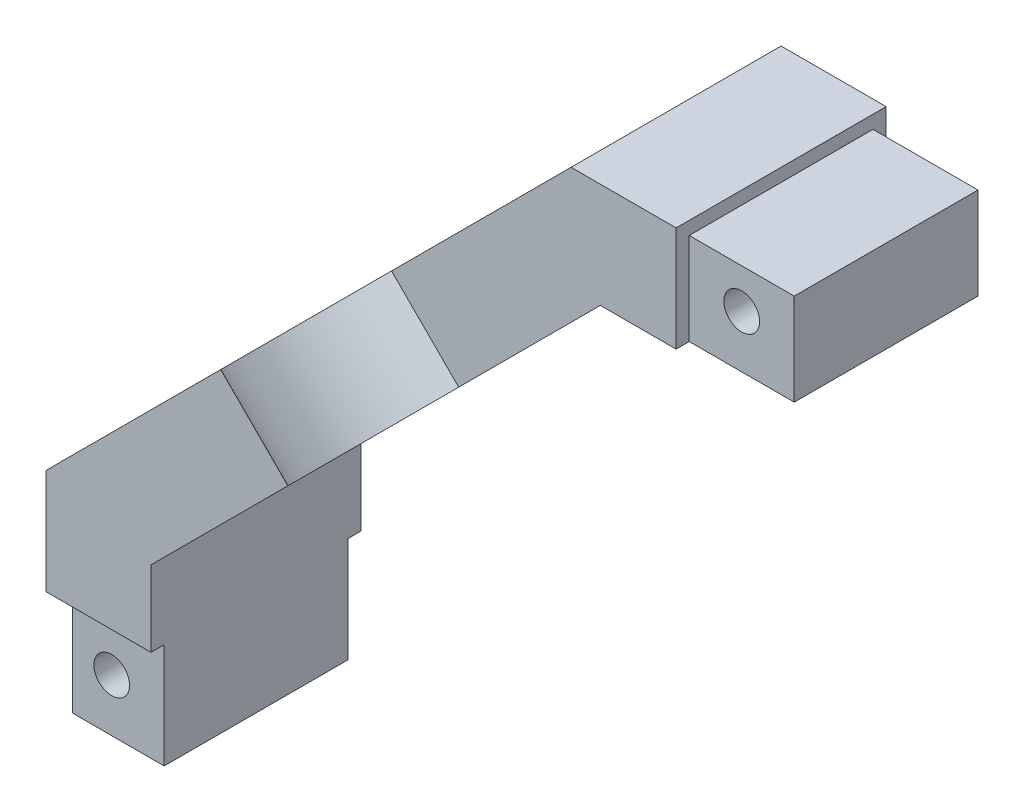
ISO-10303-21;
HEADER;
FILE_DESCRIPTION(('STEP AP214'),'2;1');
FILE_NAME('part.step','',(''),(''),'','','');
FILE_SCHEMA(('AUTOMOTIVE_DESIGN { 1 0 10303 214 1 1 1 1 }'));
ENDSEC;
DATA;
#1=APPLICATION_CONTEXT('core data for automotive mechanical design processes');
#2=APPLICATION_PROTOCOL_DEFINITION('international standard','automotive_design',2000,#1);
#3=PRODUCT_CONTEXT('',#1,'mechanical');
#4=PRODUCT('Part','Part','',(#3));
#5=PRODUCT_RELATED_PRODUCT_CATEGORY('part','',(#4));
#6=PRODUCT_DEFINITION_FORMATION('','',#4);
#7=PRODUCT_DEFINITION_CONTEXT('part definition',#1,'design');
#8=PRODUCT_DEFINITION('design','',#6,#7);
#9=PRODUCT_DEFINITION_SHAPE('','',#8);
#10=(LENGTH_UNIT() NAMED_UNIT(*) SI_UNIT(.MILLI.,.METRE.));
#11=(NAMED_UNIT(*) PLANE_ANGLE_UNIT() SI_UNIT($,.RADIAN.));
#12=(NAMED_UNIT(*) SI_UNIT($,.STERADIAN.) SOLID_ANGLE_UNIT());
#13=UNCERTAINTY_MEASURE_WITH_UNIT(LENGTH_MEASURE(1.E-05),#10,'distance_accuracy_value','');
#14=(GEOMETRIC_REPRESENTATION_CONTEXT(3) GLOBAL_UNCERTAINTY_ASSIGNED_CONTEXT((#13)) GLOBAL_UNIT_ASSIGNED_CONTEXT((#10,
#11,#12)) REPRESENTATION_CONTEXT('',''));
#15=CARTESIAN_POINT('',(0.,0.,0.));
#16=DIRECTION('',(0.,0.,1.));
#17=DIRECTION('',(1.,0.,0.));
#18=AXIS2_PLACEMENT_3D('',#15,#16,#17);
#19=CARTESIAN_POINT('',(0.,0.,0.));
#20=DIRECTION('',(0.,0.,1.));
#21=DIRECTION('',(1.,0.,0.));
#22=AXIS2_PLACEMENT_3D('',#19,#20,#21);
#23=PLANE('',#22);
#24=DIRECTION('',(-0.707106781186544,-0.707106781186551,0.));
#25=VECTOR('',#24,1.);
#26=CARTESIAN_POINT('',(39.8696158183966,-39.8696158183963,0.));
#27=LINE('',#26,#25);
#28=CARTESIAN_POINT('',(67.0392316367926,-12.7,0.));
#29=VERTEX_POINT('',#28);
#30=CARTESIAN_POINT('',(49.9098473894309,-29.8293842473619,0.));
#31=VERTEX_POINT('',#30);
#32=EDGE_CURVE('E314',#29,#31,#27,.T.);
#33=ORIENTED_EDGE('',*,*,#32,.T.);
#34=DIRECTION('',(-0.707106781186548,0.707106781186547,0.));
#35=VECTOR('',#34,1.);
#36=CARTESIAN_POINT('',(49.9098473894309,-29.829384247362,0.));
#37=LINE('',#36,#35);
#38=CARTESIAN_POINT('',(41.7902315710345,-21.7097684289655,0.));
#39=VERTEX_POINT('',#38);
#40=EDGE_CURVE('E204',#31,#39,#37,.T.);
#41=ORIENTED_EDGE('',*,*,#40,.T.);
#42=DIRECTION('',(0.707106781186547,0.707106781186548,0.));
#43=VECTOR('',#42,1.);
#44=CARTESIAN_POINT('',(31.75,-31.75,0.));
#45=LINE('',#44,#43);
#46=CARTESIAN_POINT('',(63.5,0.,0.));
#47=VERTEX_POINT('',#46);
#48=EDGE_CURVE('E273',#39,#47,#45,.T.);
#49=ORIENTED_EDGE('',*,*,#48,.T.);
#50=DIRECTION('',(1.,0.,0.));
#51=VECTOR('',#50,1.);
#52=CARTESIAN_POINT('',(0.,0.,0.));
#53=LINE('',#52,#51);
#54=CARTESIAN_POINT('',(76.2,0.,0.));
#55=VERTEX_POINT('',#54);
#56=EDGE_CURVE('E320',#47,#55,#53,.T.);
#57=ORIENTED_EDGE('',*,*,#56,.T.);
#58=DIRECTION('',(0.,-1.,0.));
#59=VECTOR('',#58,1.);
#60=CARTESIAN_POINT('',(76.2,0.,0.));
#61=LINE('',#60,#59);
#62=CARTESIAN_POINT('',(76.2,-12.7,0.));
#63=VERTEX_POINT('',#62);
#64=EDGE_CURVE('E264',#55,#63,#61,.T.);
#65=ORIENTED_EDGE('',*,*,#64,.T.);
#66=DIRECTION('',(1.,0.,0.));
#67=VECTOR('',#66,1.);
#68=CARTESIAN_POINT('',(0.,-12.7,0.));
#69=LINE('',#68,#67);
#70=EDGE_CURVE('E317',#29,#63,#69,.T.);
#71=ORIENTED_EDGE('',*,*,#70,.F.);
#72=EDGE_LOOP('',(#33,#41,#49,#57,#65,#71));
#73=FACE_BOUND('',#72,.T.);
#74=ADVANCED_FACE('F38',(#73),#23,.F.);
#75=CARTESIAN_POINT('',(0.,0.,25.4));
#76=DIRECTION('',(0.,0.,1.));
#77=DIRECTION('',(1.,0.,0.));
#78=AXIS2_PLACEMENT_3D('',#75,#76,#77);
#79=PLANE('',#78);
#80=DIRECTION('',(-0.707106781186548,0.707106781186547,0.));
#81=VECTOR('',#80,1.);
#82=CARTESIAN_POINT('',(49.9098473894309,-29.829384247362,25.4));
#83=LINE('',#82,#81);
#84=CARTESIAN_POINT('',(49.9098473894309,-29.8293842473619,25.4));
#85=VERTEX_POINT('',#84);
#86=CARTESIAN_POINT('',(41.7902315710345,-21.7097684289655,25.4));
#87=VERTEX_POINT('',#86);
#88=EDGE_CURVE('E12',#85,#87,#83,.T.);
#89=ORIENTED_EDGE('',*,*,#88,.F.);
#90=DIRECTION('',(-0.707106781186544,-0.707106781186551,0.));
#91=VECTOR('',#90,1.);
#92=CARTESIAN_POINT('',(39.8696158183966,-39.8696158183963,25.4));
#93=LINE('',#92,#91);
#94=CARTESIAN_POINT('',(67.0392316367926,-12.7,25.4));
#95=VERTEX_POINT('',#94);
#96=EDGE_CURVE('E184',#95,#85,#93,.T.);
#97=ORIENTED_EDGE('',*,*,#96,.F.);
#98=DIRECTION('',(1.,0.,0.));
#99=VECTOR('',#98,1.);
#100=CARTESIAN_POINT('',(0.,-12.7,25.4));
#101=LINE('',#100,#99);
#102=CARTESIAN_POINT('',(76.2,-12.7,25.4));
#103=VERTEX_POINT('',#102);
#104=EDGE_CURVE('E297',#95,#103,#101,.T.);
#105=ORIENTED_EDGE('',*,*,#104,.T.);
#106=DIRECTION('',(0.,-1.,0.));
#107=VECTOR('',#106,1.);
#108=CARTESIAN_POINT('',(76.2,0.,25.4));
#109=LINE('',#108,#107);
#110=CARTESIAN_POINT('',(76.2,0.,25.4));
#111=VERTEX_POINT('',#110);
#112=EDGE_CURVE('E267',#111,#103,#109,.T.);
#113=ORIENTED_EDGE('',*,*,#112,.F.);
#114=DIRECTION('',(1.,0.,0.));
#115=VECTOR('',#114,1.);
#116=CARTESIAN_POINT('',(0.,0.,25.4));
#117=LINE('',#116,#115);
#118=CARTESIAN_POINT('',(63.5,0.,25.4));
#119=VERTEX_POINT('',#118);
#120=EDGE_CURVE('E300',#119,#111,#117,.T.);
#121=ORIENTED_EDGE('',*,*,#120,.F.);
#122=DIRECTION('',(0.707106781186547,0.707106781186548,0.));
#123=VECTOR('',#122,1.);
#124=CARTESIAN_POINT('',(31.75,-31.75,25.4));
#125=LINE('',#124,#123);
#126=EDGE_CURVE('E293',#87,#119,#125,.T.);
#127=ORIENTED_EDGE('',*,*,#126,.F.);
#128=EDGE_LOOP('',(#89,#97,#105,#113,#121,#127));
#129=FACE_BOUND('',#128,.T.);
#130=ADVANCED_FACE('F388',(#129),#79,.T.);
#131=CARTESIAN_POINT('',(0.,-63.5,0.));
#132=VERTEX_POINT('',#131);
#133=CARTESIAN_POINT('',(21.7097684289653,-41.7902315710347,0.));
#134=VERTEX_POINT('',#133);
#135=EDGE_CURVE('E304',#132,#134,#45,.T.);
#136=ORIENTED_EDGE('',*,*,#135,.T.);
#137=DIRECTION('',(-0.707106781186548,0.707106781186547,0.));
#138=VECTOR('',#137,1.);
#139=CARTESIAN_POINT('',(29.8293842473617,-49.9098473894312,0.));
#140=LINE('',#139,#138);
#141=CARTESIAN_POINT('',(29.8293842473618,-49.9098473894312,0.));
#142=VERTEX_POINT('',#141);
#143=EDGE_CURVE('E202',#134,#142,#140,.F.);
#144=ORIENTED_EDGE('',*,*,#143,.T.);
#145=CARTESIAN_POINT('',(12.7,-67.0392316367931,0.));
#146=VERTEX_POINT('',#145);
#147=EDGE_CURVE('E313',#142,#146,#27,.T.);
#148=ORIENTED_EDGE('',*,*,#147,.T.);
#149=DIRECTION('',(0.,-1.,0.));
#150=VECTOR('',#149,1.);
#151=CARTESIAN_POINT('',(12.7,0.,0.));
#152=LINE('',#151,#150);
#153=CARTESIAN_POINT('',(12.7,-76.2,0.));
#154=VERTEX_POINT('',#153);
#155=EDGE_CURVE('E310',#146,#154,#152,.T.);
#156=ORIENTED_EDGE('',*,*,#155,.T.);
#157=DIRECTION('',(-1.,0.,0.));
#158=VECTOR('',#157,1.);
#159=CARTESIAN_POINT('',(0.,-76.2,0.));
#160=LINE('',#159,#158);
#161=CARTESIAN_POINT('',(0.,-76.2,0.));
#162=VERTEX_POINT('',#161);
#163=EDGE_CURVE('E278',#154,#162,#160,.T.);
#164=ORIENTED_EDGE('',*,*,#163,.T.);
#165=DIRECTION('',(0.,-1.,0.));
#166=VECTOR('',#165,1.);
#167=CARTESIAN_POINT('',(0.,0.,0.));
#168=LINE('',#167,#166);
#169=EDGE_CURVE('E307',#132,#162,#168,.T.);
#170=ORIENTED_EDGE('',*,*,#169,.F.);
#171=EDGE_LOOP('',(#136,#144,#148,#156,#164,#170));
#172=FACE_BOUND('',#171,.T.);
#173=ADVANCED_FACE('F371',(#172),#23,.F.);
#174=CARTESIAN_POINT('',(31.75,-31.75,25.4));
#175=DIRECTION('',(-0.707106781186548,0.707106781186547,0.));
#176=DIRECTION('',(-0.707106781186547,-0.707106781186548,0.));
#177=AXIS2_PLACEMENT_3D('',#174,#175,#176);
#178=PLANE('',#177);
#179=CARTESIAN_POINT('',(31.7499999999998,-31.7500000000002,12.7));
#180=DIRECTION('',(-0.707106781186548,0.707106781186547,0.));
#181=DIRECTION('',(-0.707106781186547,-0.707106781186548,0.));
#182=AXIS2_PLACEMENT_3D('',#179,#180,#181);
#183=CIRCLE('',#182,11.1125);
#184=CARTESIAN_POINT('',(23.8922758940643,-39.6077241059357,12.7));
#185=VERTEX_POINT('',#184);
#186=EDGE_CURVE('E198',#185,#185,#183,.F.);
#187=ORIENTED_EDGE('',*,*,#186,.T.);
#188=EDGE_LOOP('',(#187));
#189=FACE_BOUND('',#188,.T.);
#190=CARTESIAN_POINT('',(0.,-63.5,25.4));
#191=VERTEX_POINT('',#190);
#192=CARTESIAN_POINT('',(21.7097684289653,-41.7902315710347,25.4));
#193=VERTEX_POINT('',#192);
#194=EDGE_CURVE('E290',#191,#193,#125,.T.);
#195=ORIENTED_EDGE('',*,*,#194,.T.);
#196=CARTESIAN_POINT('',(31.7499999999999,-31.7500000000001,12.7));
#197=DIRECTION('',(-0.707106781186548,0.707106781186547,0.));
#198=DIRECTION('',(-0.707106781186547,-0.707106781186548,0.));
#199=AXIS2_PLACEMENT_3D('',#196,#197,#198);
#200=CIRCLE('',#199,19.05);
#201=EDGE_CURVE('E192',#87,#193,#200,.F.);
#202=ORIENTED_EDGE('',*,*,#201,.F.);
#203=ORIENTED_EDGE('',*,*,#126,.T.);
#204=DIRECTION('',(0.,0.,-1.));
#205=VECTOR('',#204,1.);
#206=CARTESIAN_POINT('',(63.5,0.,25.4));
#207=LINE('',#206,#205);
#208=EDGE_CURVE('E303',#119,#47,#207,.T.);
#209=ORIENTED_EDGE('',*,*,#208,.T.);
#210=ORIENTED_EDGE('',*,*,#48,.F.);
#211=EDGE_CURVE('E196',#134,#39,#200,.F.);
#212=ORIENTED_EDGE('',*,*,#211,.F.);
#213=ORIENTED_EDGE('',*,*,#135,.F.);
#214=DIRECTION('',(0.,0.,-1.));
#215=VECTOR('',#214,1.);
#216=CARTESIAN_POINT('',(0.,-63.5,25.4));
#217=LINE('',#216,#215);
#218=EDGE_CURVE('E335',#191,#132,#217,.T.);
#219=ORIENTED_EDGE('',*,*,#218,.F.);
#220=EDGE_LOOP('',(#195,#202,#203,#209,#210,#212,#213,#219));
#221=FACE_BOUND('',#220,.T.);
#222=ADVANCED_FACE('F40',(#189,#221),#178,.T.);
#223=CARTESIAN_POINT('',(0.,0.,25.4));
#224=DIRECTION('',(1.,0.,0.));
#225=DIRECTION('',(0.,1.,0.));
#226=AXIS2_PLACEMENT_3D('',#223,#224,#225);
#227=PLANE('',#226);
#228=ORIENTED_EDGE('',*,*,#169,.T.);
#229=DIRECTION('',(0.,0.,1.));
#230=VECTOR('',#229,1.);
#231=CARTESIAN_POINT('',(0.,-76.2,0.));
#232=LINE('',#231,#230);
#233=CARTESIAN_POINT('',(0.,-76.2,25.4));
#234=VERTEX_POINT('',#233);
#235=EDGE_CURVE('E269',#162,#234,#232,.T.);
#236=ORIENTED_EDGE('',*,*,#235,.T.);
#237=DIRECTION('',(0.,-1.,0.));
#238=VECTOR('',#237,1.);
#239=CARTESIAN_POINT('',(0.,0.,25.4));
#240=LINE('',#239,#238);
#241=EDGE_CURVE('E292',#191,#234,#240,.T.);
#242=ORIENTED_EDGE('',*,*,#241,.F.);
#243=ORIENTED_EDGE('',*,*,#218,.T.);
#244=EDGE_LOOP('',(#228,#236,#242,#243));
#245=FACE_BOUND('',#244,.T.);
#246=ADVANCED_FACE('F367',(#245),#227,.F.);
#247=CARTESIAN_POINT('',(0.,-88.9,25.4));
#248=DIRECTION('',(0.,1.,0.));
#249=DIRECTION('',(-1.,0.,0.));
#250=AXIS2_PLACEMENT_3D('',#247,#248,#249);
#251=PLANE('',#250);
#252=DIRECTION('',(0.,0.,-1.));
#253=VECTOR('',#252,1.);
#254=CARTESIAN_POINT('',(12.7,-88.9,25.4));
#255=LINE('',#254,#253);
#256=CARTESIAN_POINT('',(12.7,-88.9,23.8125));
#257=VERTEX_POINT('',#256);
#258=CARTESIAN_POINT('',(12.7,-88.9,1.5748));
#259=VERTEX_POINT('',#258);
#260=EDGE_CURVE('E332',#257,#259,#255,.T.);
#261=ORIENTED_EDGE('',*,*,#260,.F.);
#262=DIRECTION('',(1.,0.,0.));
#263=VECTOR('',#262,1.);
#264=CARTESIAN_POINT('',(12.7,-88.9,23.8125));
#265=LINE('',#264,#263);
#266=CARTESIAN_POINT('',(1.58750000000001,-88.9,23.8125));
#267=VERTEX_POINT('',#266);
#268=EDGE_CURVE('E243',#267,#257,#265,.T.);
#269=ORIENTED_EDGE('',*,*,#268,.F.);
#270=DIRECTION('',(0.,0.,1.));
#271=VECTOR('',#270,1.);
#272=CARTESIAN_POINT('',(1.58750000000001,-88.9,0.));
#273=LINE('',#272,#271);
#274=CARTESIAN_POINT('',(1.58750000000001,-88.9,1.5748));
#275=VERTEX_POINT('',#274);
#276=EDGE_CURVE('E281',#275,#267,#273,.T.);
#277=ORIENTED_EDGE('',*,*,#276,.F.);
#278=DIRECTION('',(-1.,0.,0.));
#279=VECTOR('',#278,1.);
#280=CARTESIAN_POINT('',(12.7,-88.9,1.5748));
#281=LINE('',#280,#279);
#282=EDGE_CURVE('E238',#259,#275,#281,.T.);
#283=ORIENTED_EDGE('',*,*,#282,.F.);
#284=EDGE_LOOP('',(#261,#269,#277,#283));
#285=FACE_BOUND('',#284,.T.);
#286=ADVANCED_FACE('F359',(#285),#251,.F.);
#287=CARTESIAN_POINT('',(12.7,0.,25.4));
#288=DIRECTION('',(1.,0.,0.));
#289=DIRECTION('',(0.,1.,0.));
#290=AXIS2_PLACEMENT_3D('',#287,#288,#289);
#291=PLANE('',#290);
#292=DIRECTION('',(0.,-1.,0.));
#293=VECTOR('',#292,1.);
#294=CARTESIAN_POINT('',(12.7,-76.2,23.8125));
#295=LINE('',#294,#293);
#296=CARTESIAN_POINT('',(12.7,-76.2,23.8125));
#297=VERTEX_POINT('',#296);
#298=EDGE_CURVE('E245',#297,#257,#295,.T.);
#299=ORIENTED_EDGE('',*,*,#298,.T.);
#300=ORIENTED_EDGE('',*,*,#260,.T.);
#301=DIRECTION('',(0.,-1.,0.));
#302=VECTOR('',#301,1.);
#303=CARTESIAN_POINT('',(12.7,-76.2,1.5748));
#304=LINE('',#303,#302);
#305=CARTESIAN_POINT('',(12.7,-76.2,1.5748));
#306=VERTEX_POINT('',#305);
#307=EDGE_CURVE('E247',#306,#259,#304,.T.);
#308=ORIENTED_EDGE('',*,*,#307,.F.);
#309=DIRECTION('',(0.,0.,1.));
#310=VECTOR('',#309,1.);
#311=CARTESIAN_POINT('',(12.7,-76.2,0.));
#312=LINE('',#311,#310);
#313=EDGE_CURVE('E251',#154,#306,#312,.T.);
#314=ORIENTED_EDGE('',*,*,#313,.F.);
#315=ORIENTED_EDGE('',*,*,#155,.F.);
#316=DIRECTION('',(0.,0.,-1.));
#317=VECTOR('',#316,1.);
#318=CARTESIAN_POINT('',(12.7,-67.0392316367931,25.4));
#319=LINE('',#318,#317);
#320=CARTESIAN_POINT('',(12.7,-67.0392316367931,25.4));
#321=VERTEX_POINT('',#320);
#322=EDGE_CURVE('E330',#321,#146,#319,.T.);
#323=ORIENTED_EDGE('',*,*,#322,.F.);
#324=DIRECTION('',(0.,-1.,0.));
#325=VECTOR('',#324,1.);
#326=CARTESIAN_POINT('',(12.7,0.,25.4));
#327=LINE('',#326,#325);
#328=CARTESIAN_POINT('',(12.7,-76.2,25.4));
#329=VERTEX_POINT('',#328);
#330=EDGE_CURVE('E179',#321,#329,#327,.T.);
#331=ORIENTED_EDGE('',*,*,#330,.T.);
#332=DIRECTION('',(0.,0.,1.));
#333=VECTOR('',#332,1.);
#334=CARTESIAN_POINT('',(12.7,-76.2,25.4));
#335=LINE('',#334,#333);
#336=EDGE_CURVE('E239',#297,#329,#335,.T.);
#337=ORIENTED_EDGE('',*,*,#336,.F.);
#338=EDGE_LOOP('',(#299,#300,#308,#314,#315,#323,#331,#337));
#339=FACE_BOUND('',#338,.T.);
#340=ADVANCED_FACE('F364',(#339),#291,.T.);
#341=CARTESIAN_POINT('',(39.8696158183966,-39.8696158183963,25.4));
#342=DIRECTION('',(0.707106781186551,-0.707106781186544,0.));
#343=DIRECTION('',(0.707106781186544,0.707106781186551,0.));
#344=AXIS2_PLACEMENT_3D('',#341,#342,#343);
#345=PLANE('',#344);
#346=CARTESIAN_POINT('',(39.8696158183963,-39.8696158183966,12.7));
#347=DIRECTION('',(-0.707106781186551,0.707106781186544,0.));
#348=DIRECTION('',(-0.707106781186544,-0.707106781186551,0.));
#349=AXIS2_PLACEMENT_3D('',#346,#347,#348);
#350=CIRCLE('',#349,11.1125);
#351=CARTESIAN_POINT('',(32.0118917124609,-47.7273399243321,12.7));
#352=VERTEX_POINT('',#351);
#353=EDGE_CURVE('E435',#352,#352,#350,.T.);
#354=ORIENTED_EDGE('',*,*,#353,.T.);
#355=EDGE_LOOP('',(#354));
#356=FACE_BOUND('',#355,.T.);
#357=ORIENTED_EDGE('',*,*,#96,.T.);
#358=CARTESIAN_POINT('',(39.8696158183963,-39.8696158183966,12.7));
#359=DIRECTION('',(-0.707106781186551,0.707106781186544,0.));
#360=DIRECTION('',(-0.707106781186544,-0.707106781186551,0.));
#361=AXIS2_PLACEMENT_3D('',#358,#359,#360);
#362=CIRCLE('',#361,19.05);
#363=CARTESIAN_POINT('',(29.8293842473618,-49.9098473894312,25.4));
#364=VERTEX_POINT('',#363);
#365=EDGE_CURVE('E190',#364,#85,#362,.T.);
#366=ORIENTED_EDGE('',*,*,#365,.F.);
#367=EDGE_CURVE('E173',#364,#321,#93,.T.);
#368=ORIENTED_EDGE('',*,*,#367,.T.);
#369=ORIENTED_EDGE('',*,*,#322,.T.);
#370=ORIENTED_EDGE('',*,*,#147,.F.);
#371=EDGE_CURVE('E53',#31,#142,#362,.T.);
#372=ORIENTED_EDGE('',*,*,#371,.F.);
#373=ORIENTED_EDGE('',*,*,#32,.F.);
#374=DIRECTION('',(0.,0.,-1.));
#375=VECTOR('',#374,1.);
#376=CARTESIAN_POINT('',(67.0392316367926,-12.7,25.4));
#377=LINE('',#376,#375);
#378=EDGE_CURVE('E328',#95,#29,#377,.T.);
#379=ORIENTED_EDGE('',*,*,#378,.F.);
#380=EDGE_LOOP('',(#357,#366,#368,#369,#370,#372,#373,#379));
#381=FACE_BOUND('',#380,.T.);
#382=ADVANCED_FACE('F194',(#356,#381),#345,.T.);
#383=CARTESIAN_POINT('',(0.,-12.7,25.4));
#384=DIRECTION('',(0.,1.,0.));
#385=DIRECTION('',(0.,0.,1.));
#386=AXIS2_PLACEMENT_3D('',#383,#384,#385);
#387=PLANE('',#386);
#388=DIRECTION('',(0.,0.,-1.));
#389=VECTOR('',#388,1.);
#390=CARTESIAN_POINT('',(76.2,-12.7,0.));
#391=LINE('',#390,#389);
#392=CARTESIAN_POINT('',(76.2,-12.7,1.5875));
#393=VERTEX_POINT('',#392);
#394=EDGE_CURVE('E210',#393,#63,#391,.T.);
#395=ORIENTED_EDGE('',*,*,#394,.F.);
#396=DIRECTION('',(1.,0.,0.));
#397=VECTOR('',#396,1.);
#398=CARTESIAN_POINT('',(76.2,-12.7,1.5875));
#399=LINE('',#398,#397);
#400=CARTESIAN_POINT('',(88.9,-12.7,1.5875));
#401=VERTEX_POINT('',#400);
#402=EDGE_CURVE('E214',#393,#401,#399,.T.);
#403=ORIENTED_EDGE('',*,*,#402,.T.);
#404=DIRECTION('',(0.,0.,-1.));
#405=VECTOR('',#404,1.);
#406=CARTESIAN_POINT('',(88.9,-12.7,25.4));
#407=LINE('',#406,#405);
#408=CARTESIAN_POINT('',(88.9,-12.7,23.8125));
#409=VERTEX_POINT('',#408);
#410=EDGE_CURVE('E325',#409,#401,#407,.T.);
#411=ORIENTED_EDGE('',*,*,#410,.F.);
#412=DIRECTION('',(1.,0.,0.));
#413=VECTOR('',#412,1.);
#414=CARTESIAN_POINT('',(76.2,-12.7,23.8125));
#415=LINE('',#414,#413);
#416=CARTESIAN_POINT('',(76.2,-12.7,23.8125));
#417=VERTEX_POINT('',#416);
#418=EDGE_CURVE('E216',#417,#409,#415,.T.);
#419=ORIENTED_EDGE('',*,*,#418,.F.);
#420=DIRECTION('',(0.,0.,-1.));
#421=VECTOR('',#420,1.);
#422=CARTESIAN_POINT('',(76.2,-12.7,25.4));
#423=LINE('',#422,#421);
#424=EDGE_CURVE('E220',#103,#417,#423,.T.);
#425=ORIENTED_EDGE('',*,*,#424,.F.);
#426=ORIENTED_EDGE('',*,*,#104,.F.);
#427=ORIENTED_EDGE('',*,*,#378,.T.);
#428=ORIENTED_EDGE('',*,*,#70,.T.);
#429=EDGE_LOOP('',(#395,#403,#411,#419,#425,#426,#427,#428));
#430=FACE_BOUND('',#429,.T.);
#431=ADVANCED_FACE('F385',(#430),#387,.F.);
#432=CARTESIAN_POINT('',(88.9,0.,25.4));
#433=DIRECTION('',(1.,0.,0.));
#434=DIRECTION('',(0.,0.,-1.));
#435=AXIS2_PLACEMENT_3D('',#432,#433,#434);
#436=PLANE('',#435);
#437=DIRECTION('',(0.,-1.,0.));
#438=VECTOR('',#437,1.);
#439=CARTESIAN_POINT('',(88.9,-12.7,1.5875));
#440=LINE('',#439,#438);
#441=CARTESIAN_POINT('',(88.9,-1.5875,1.5875));
#442=VERTEX_POINT('',#441);
#443=EDGE_CURVE('E211',#442,#401,#440,.T.);
#444=ORIENTED_EDGE('',*,*,#443,.F.);
#445=DIRECTION('',(0.,0.,1.));
#446=VECTOR('',#445,1.);
#447=CARTESIAN_POINT('',(88.9,-1.5875,0.));
#448=LINE('',#447,#446);
#449=CARTESIAN_POINT('',(88.9,-1.5875,23.8125));
#450=VERTEX_POINT('',#449);
#451=EDGE_CURVE('E270',#442,#450,#448,.T.);
#452=ORIENTED_EDGE('',*,*,#451,.T.);
#453=DIRECTION('',(0.,1.,0.));
#454=VECTOR('',#453,1.);
#455=CARTESIAN_POINT('',(88.9,-12.7,23.8125));
#456=LINE('',#455,#454);
#457=EDGE_CURVE('E207',#409,#450,#456,.T.);
#458=ORIENTED_EDGE('',*,*,#457,.F.);
#459=ORIENTED_EDGE('',*,*,#410,.T.);
#460=EDGE_LOOP('',(#444,#452,#458,#459));
#461=FACE_BOUND('',#460,.T.);
#462=ADVANCED_FACE('F407',(#461),#436,.T.);
#463=CARTESIAN_POINT('',(0.,0.,25.4));
#464=DIRECTION('',(0.,1.,0.));
#465=DIRECTION('',(0.,0.,1.));
#466=AXIS2_PLACEMENT_3D('',#463,#464,#465);
#467=PLANE('',#466);
#468=DIRECTION('',(0.,0.,1.));
#469=VECTOR('',#468,1.);
#470=CARTESIAN_POINT('',(76.2,0.,0.));
#471=LINE('',#470,#469);
#472=EDGE_CURVE('E266',#55,#111,#471,.T.);
#473=ORIENTED_EDGE('',*,*,#472,.F.);
#474=ORIENTED_EDGE('',*,*,#56,.F.);
#475=ORIENTED_EDGE('',*,*,#208,.F.);
#476=ORIENTED_EDGE('',*,*,#120,.T.);
#477=EDGE_LOOP('',(#473,#474,#475,#476));
#478=FACE_BOUND('',#477,.T.);
#479=ADVANCED_FACE('F399',(#478),#467,.T.);
#480=DIRECTION('',(-0.707106781186548,0.707106781186547,0.));
#481=VECTOR('',#480,1.);
#482=CARTESIAN_POINT('',(29.8293842473617,-49.9098473894312,25.4));
#483=LINE('',#482,#481);
#484=EDGE_CURVE('E46',#193,#364,#483,.F.);
#485=ORIENTED_EDGE('',*,*,#484,.F.);
#486=ORIENTED_EDGE('',*,*,#194,.F.);
#487=ORIENTED_EDGE('',*,*,#241,.T.);
#488=DIRECTION('',(-1.,0.,0.));
#489=VECTOR('',#488,1.);
#490=CARTESIAN_POINT('',(0.,-76.2,25.4));
#491=LINE('',#490,#489);
#492=EDGE_CURVE('E263',#329,#234,#491,.T.);
#493=ORIENTED_EDGE('',*,*,#492,.F.);
#494=ORIENTED_EDGE('',*,*,#330,.F.);
#495=ORIENTED_EDGE('',*,*,#367,.F.);
#496=EDGE_LOOP('',(#485,#486,#487,#493,#494,#495));
#497=FACE_BOUND('',#496,.T.);
#498=ADVANCED_FACE('F175',(#497),#79,.T.);
#499=CARTESIAN_POINT('',(88.9,-1.5875,0.));
#500=DIRECTION('',(0.,-1.,0.));
#501=DIRECTION('',(1.,0.,0.));
#502=AXIS2_PLACEMENT_3D('',#499,#500,#501);
#503=PLANE('',#502);
#504=ORIENTED_EDGE('',*,*,#451,.F.);
#505=DIRECTION('',(-1.,0.,0.));
#506=VECTOR('',#505,1.);
#507=CARTESIAN_POINT('',(88.9,-1.5875,1.5875));
#508=LINE('',#507,#506);
#509=CARTESIAN_POINT('',(76.2,-1.5875,1.5875));
#510=VERTEX_POINT('',#509);
#511=EDGE_CURVE('E232',#442,#510,#508,.T.);
#512=ORIENTED_EDGE('',*,*,#511,.T.);
#513=DIRECTION('',(0.,0.,1.));
#514=VECTOR('',#513,1.);
#515=CARTESIAN_POINT('',(76.2,-1.5875,0.));
#516=LINE('',#515,#514);
#517=CARTESIAN_POINT('',(76.2,-1.5875,23.8125));
#518=VERTEX_POINT('',#517);
#519=EDGE_CURVE('E274',#510,#518,#516,.T.);
#520=ORIENTED_EDGE('',*,*,#519,.T.);
#521=DIRECTION('',(1.,0.,0.));
#522=VECTOR('',#521,1.);
#523=CARTESIAN_POINT('',(88.9,-1.5875,23.8125));
#524=LINE('',#523,#522);
#525=EDGE_CURVE('E219',#518,#450,#524,.T.);
#526=ORIENTED_EDGE('',*,*,#525,.T.);
#527=EDGE_LOOP('',(#504,#512,#520,#526));
#528=FACE_BOUND('',#527,.T.);
#529=ADVANCED_FACE('F398',(#528),#503,.F.);
#530=CARTESIAN_POINT('',(76.2,0.,0.));
#531=DIRECTION('',(-1.,0.,0.));
#532=DIRECTION('',(0.,0.,1.));
#533=AXIS2_PLACEMENT_3D('',#530,#531,#532);
#534=PLANE('',#533);
#535=ORIENTED_EDGE('',*,*,#519,.F.);
#536=DIRECTION('',(0.,-1.,0.));
#537=VECTOR('',#536,1.);
#538=CARTESIAN_POINT('',(76.2,-12.7,1.5875));
#539=LINE('',#538,#537);
#540=EDGE_CURVE('E208',#510,#393,#539,.T.);
#541=ORIENTED_EDGE('',*,*,#540,.T.);
#542=ORIENTED_EDGE('',*,*,#394,.T.);
#543=ORIENTED_EDGE('',*,*,#64,.F.);
#544=ORIENTED_EDGE('',*,*,#472,.T.);
#545=ORIENTED_EDGE('',*,*,#112,.T.);
#546=ORIENTED_EDGE('',*,*,#424,.T.);
#547=DIRECTION('',(0.,1.,0.));
#548=VECTOR('',#547,1.);
#549=CARTESIAN_POINT('',(76.2,-12.7,23.8125));
#550=LINE('',#549,#548);
#551=EDGE_CURVE('E223',#417,#518,#550,.T.);
#552=ORIENTED_EDGE('',*,*,#551,.T.);
#553=EDGE_LOOP('',(#535,#541,#542,#543,#544,#545,#546,#552));
#554=FACE_BOUND('',#553,.T.);
#555=ADVANCED_FACE('F404',(#554),#534,.F.);
#556=CARTESIAN_POINT('',(0.,-76.2,0.));
#557=DIRECTION('',(0.,1.,0.));
#558=DIRECTION('',(0.,0.,1.));
#559=AXIS2_PLACEMENT_3D('',#556,#557,#558);
#560=PLANE('',#559);
#561=DIRECTION('',(0.,0.,1.));
#562=VECTOR('',#561,1.);
#563=CARTESIAN_POINT('',(1.58750000000001,-76.2,0.));
#564=LINE('',#563,#562);
#565=CARTESIAN_POINT('',(1.58750000000001,-76.2,1.5748));
#566=VERTEX_POINT('',#565);
#567=CARTESIAN_POINT('',(1.58750000000001,-76.2,23.8125));
#568=VERTEX_POINT('',#567);
#569=EDGE_CURVE('E285',#566,#568,#564,.T.);
#570=ORIENTED_EDGE('',*,*,#569,.T.);
#571=DIRECTION('',(1.,0.,0.));
#572=VECTOR('',#571,1.);
#573=CARTESIAN_POINT('',(12.7,-76.2,23.8125));
#574=LINE('',#573,#572);
#575=EDGE_CURVE('E242',#568,#297,#574,.T.);
#576=ORIENTED_EDGE('',*,*,#575,.T.);
#577=ORIENTED_EDGE('',*,*,#336,.T.);
#578=ORIENTED_EDGE('',*,*,#492,.T.);
#579=ORIENTED_EDGE('',*,*,#235,.F.);
#580=ORIENTED_EDGE('',*,*,#163,.F.);
#581=ORIENTED_EDGE('',*,*,#313,.T.);
#582=DIRECTION('',(-1.,0.,0.));
#583=VECTOR('',#582,1.);
#584=CARTESIAN_POINT('',(12.7,-76.2,1.5748));
#585=LINE('',#584,#583);
#586=EDGE_CURVE('E254',#306,#566,#585,.T.);
#587=ORIENTED_EDGE('',*,*,#586,.T.);
#588=EDGE_LOOP('',(#570,#576,#577,#578,#579,#580,#581,#587));
#589=FACE_BOUND('',#588,.T.);
#590=ADVANCED_FACE('F348',(#589),#560,.F.);
#591=CARTESIAN_POINT('',(1.58750000000001,-88.9,0.));
#592=DIRECTION('',(1.,0.,0.));
#593=DIRECTION('',(0.,0.,-1.));
#594=AXIS2_PLACEMENT_3D('',#591,#592,#593);
#595=PLANE('',#594);
#596=ORIENTED_EDGE('',*,*,#276,.T.);
#597=DIRECTION('',(0.,1.,0.));
#598=VECTOR('',#597,1.);
#599=CARTESIAN_POINT('',(1.58750000000001,-88.9,23.8125));
#600=LINE('',#599,#598);
#601=EDGE_CURVE('E193',#267,#568,#600,.T.);
#602=ORIENTED_EDGE('',*,*,#601,.T.);
#603=ORIENTED_EDGE('',*,*,#569,.F.);
#604=DIRECTION('',(0.,-1.,0.));
#605=VECTOR('',#604,1.);
#606=CARTESIAN_POINT('',(1.58750000000001,-88.9,1.5748));
#607=LINE('',#606,#605);
#608=EDGE_CURVE('E337',#566,#275,#607,.T.);
#609=ORIENTED_EDGE('',*,*,#608,.T.);
#610=EDGE_LOOP('',(#596,#602,#603,#609));
#611=FACE_BOUND('',#610,.T.);
#612=ADVANCED_FACE('F343',(#611),#595,.F.);
#613=CARTESIAN_POINT('',(12.7,-76.2,1.5748));
#614=DIRECTION('',(0.,0.,1.));
#615=DIRECTION('',(1.,0.,0.));
#616=AXIS2_PLACEMENT_3D('',#613,#614,#615);
#617=PLANE('',#616);
#618=ORIENTED_EDGE('',*,*,#586,.F.);
#619=ORIENTED_EDGE('',*,*,#307,.T.);
#620=ORIENTED_EDGE('',*,*,#282,.T.);
#621=ORIENTED_EDGE('',*,*,#608,.F.);
#622=EDGE_LOOP('',(#618,#619,#620,#621));
#623=FACE_BOUND('',#622,.T.);
#624=CARTESIAN_POINT('',(6.36270000000001,-82.55,1.5748));
#625=DIRECTION('',(0.,0.,1.));
#626=DIRECTION('',(1.,0.,0.));
#627=AXIS2_PLACEMENT_3D('',#624,#625,#626);
#628=CIRCLE('',#627,2.159);
#629=CARTESIAN_POINT('',(8.52170000000001,-82.55,1.5748));
#630=VERTEX_POINT('',#629);
#631=EDGE_CURVE('E250',#630,#630,#628,.F.);
#632=ORIENTED_EDGE('',*,*,#631,.F.);
#633=EDGE_LOOP('',(#632));
#634=FACE_BOUND('',#633,.T.);
#635=ADVANCED_FACE('F354',(#623,#634),#617,.F.);
#636=CARTESIAN_POINT('',(12.7,-76.2,23.8125));
#637=DIRECTION('',(0.,0.,-1.));
#638=DIRECTION('',(-1.,0.,0.));
#639=AXIS2_PLACEMENT_3D('',#636,#637,#638);
#640=PLANE('',#639);
#641=ORIENTED_EDGE('',*,*,#268,.T.);
#642=ORIENTED_EDGE('',*,*,#298,.F.);
#643=ORIENTED_EDGE('',*,*,#575,.F.);
#644=ORIENTED_EDGE('',*,*,#601,.F.);
#645=EDGE_LOOP('',(#641,#642,#643,#644));
#646=FACE_BOUND('',#645,.T.);
#647=CARTESIAN_POINT('',(6.36270000000001,-82.55,23.8125));
#648=DIRECTION('',(0.,0.,-1.));
#649=DIRECTION('',(-1.,0.,0.));
#650=AXIS2_PLACEMENT_3D('',#647,#648,#649);
#651=CIRCLE('',#650,2.159);
#652=CARTESIAN_POINT('',(4.20370000000001,-82.55,23.8125));
#653=VERTEX_POINT('',#652);
#654=EDGE_CURVE('E260',#653,#653,#651,.F.);
#655=ORIENTED_EDGE('',*,*,#654,.F.);
#656=EDGE_LOOP('',(#655));
#657=FACE_BOUND('',#656,.T.);
#658=ADVANCED_FACE('F360',(#646,#657),#640,.F.);
#659=CARTESIAN_POINT('',(6.36270000000001,-82.55,0.));
#660=DIRECTION('',(0.,0.,1.));
#661=DIRECTION('',(1.,0.,0.));
#662=AXIS2_PLACEMENT_3D('',#659,#660,#661);
#663=CYLINDRICAL_SURFACE('',#662,2.159);
#664=ORIENTED_EDGE('',*,*,#654,.T.);
#665=EDGE_LOOP('',(#664));
#666=FACE_BOUND('',#665,.T.);
#667=ORIENTED_EDGE('',*,*,#631,.T.);
#668=EDGE_LOOP('',(#667));
#669=FACE_BOUND('',#668,.T.);
#670=ADVANCED_FACE('F456',(#666,#669),#663,.F.);
#671=CARTESIAN_POINT('',(76.2,-12.7,23.8125));
#672=DIRECTION('',(0.,0.,-1.));
#673=DIRECTION('',(-1.,0.,0.));
#674=AXIS2_PLACEMENT_3D('',#671,#672,#673);
#675=PLANE('',#674);
#676=ORIENTED_EDGE('',*,*,#551,.F.);
#677=ORIENTED_EDGE('',*,*,#418,.T.);
#678=ORIENTED_EDGE('',*,*,#457,.T.);
#679=ORIENTED_EDGE('',*,*,#525,.F.);
#680=EDGE_LOOP('',(#676,#677,#678,#679));
#681=FACE_BOUND('',#680,.T.);
#682=CARTESIAN_POINT('',(82.55,-6.3627,23.8125));
#683=DIRECTION('',(0.,0.,-1.));
#684=DIRECTION('',(-1.,0.,0.));
#685=AXIS2_PLACEMENT_3D('',#682,#683,#684);
#686=CIRCLE('',#685,2.15899999999999);
#687=CARTESIAN_POINT('',(80.391,-6.3627,23.8125));
#688=VERTEX_POINT('',#687);
#689=EDGE_CURVE('E229',#688,#688,#686,.F.);
#690=ORIENTED_EDGE('',*,*,#689,.F.);
#691=EDGE_LOOP('',(#690));
#692=FACE_BOUND('',#691,.T.);
#693=ADVANCED_FACE('F452',(#681,#692),#675,.F.);
#694=CARTESIAN_POINT('',(76.2,-12.7,1.5875));
#695=DIRECTION('',(0.,0.,1.));
#696=DIRECTION('',(0.,-1.,0.));
#697=AXIS2_PLACEMENT_3D('',#694,#695,#696);
#698=PLANE('',#697);
#699=ORIENTED_EDGE('',*,*,#443,.T.);
#700=ORIENTED_EDGE('',*,*,#402,.F.);
#701=ORIENTED_EDGE('',*,*,#540,.F.);
#702=ORIENTED_EDGE('',*,*,#511,.F.);
#703=EDGE_LOOP('',(#699,#700,#701,#702));
#704=FACE_BOUND('',#703,.T.);
#705=CARTESIAN_POINT('',(82.55,-6.3627,1.5875));
#706=DIRECTION('',(0.,0.,1.));
#707=DIRECTION('',(0.,-1.,0.));
#708=AXIS2_PLACEMENT_3D('',#705,#706,#707);
#709=CIRCLE('',#708,2.15899999999999);
#710=CARTESIAN_POINT('',(82.55,-8.5217,1.5875));
#711=VERTEX_POINT('',#710);
#712=EDGE_CURVE('E235',#711,#711,#709,.F.);
#713=ORIENTED_EDGE('',*,*,#712,.F.);
#714=EDGE_LOOP('',(#713));
#715=FACE_BOUND('',#714,.T.);
#716=ADVANCED_FACE('F449',(#704,#715),#698,.F.);
#717=CARTESIAN_POINT('',(82.55,-6.3627,0.));
#718=DIRECTION('',(0.,0.,1.));
#719=DIRECTION('',(1.,0.,0.));
#720=AXIS2_PLACEMENT_3D('',#717,#718,#719);
#721=CYLINDRICAL_SURFACE('',#720,2.15899999999999);
#722=ORIENTED_EDGE('',*,*,#712,.T.);
#723=EDGE_LOOP('',(#722));
#724=FACE_BOUND('',#723,.T.);
#725=ORIENTED_EDGE('',*,*,#689,.T.);
#726=EDGE_LOOP('',(#725));
#727=FACE_BOUND('',#726,.T.);
#728=ADVANCED_FACE('F448',(#724,#727),#721,.F.);
#729=CARTESIAN_POINT('',(39.8696158183963,-39.8696158183966,12.7));
#730=DIRECTION('',(-0.707106781186548,0.707106781186547,0.));
#731=DIRECTION('',(-0.707106781186547,-0.707106781186548,0.));
#732=AXIS2_PLACEMENT_3D('',#729,#730,#731);
#733=CYLINDRICAL_SURFACE('',#732,19.05);
#734=ORIENTED_EDGE('',*,*,#365,.T.);
#735=ORIENTED_EDGE('',*,*,#88,.T.);
#736=ORIENTED_EDGE('',*,*,#201,.T.);
#737=ORIENTED_EDGE('',*,*,#484,.T.);
#738=EDGE_LOOP('',(#734,#735,#736,#737));
#739=FACE_BOUND('',#738,.T.);
#740=ADVANCED_FACE('F189',(#739),#733,.T.);
#741=ORIENTED_EDGE('',*,*,#40,.F.);
#742=ORIENTED_EDGE('',*,*,#371,.T.);
#743=ORIENTED_EDGE('',*,*,#143,.F.);
#744=ORIENTED_EDGE('',*,*,#211,.T.);
#745=EDGE_LOOP('',(#741,#742,#743,#744));
#746=FACE_BOUND('',#745,.T.);
#747=ADVANCED_FACE('F375',(#746),#733,.T.);
#748=CARTESIAN_POINT('',(39.8696158183963,-39.8696158183966,12.7));
#749=DIRECTION('',(-0.707106781186551,0.707106781186544,0.));
#750=DIRECTION('',(-0.707106781186544,-0.707106781186551,0.));
#751=AXIS2_PLACEMENT_3D('',#748,#749,#750);
#752=CYLINDRICAL_SURFACE('',#751,11.1125);
#753=CARTESIAN_POINT('',(32.0118917124609,-47.7273399243321,12.7));
#754=CARTESIAN_POINT('',(31.9273123810192,-47.6427605928905,12.7));
#755=CARTESIAN_POINT('',(31.8427330495776,-47.5581812614489,12.7));
#756=CARTESIAN_POINT('',(31.6735743866943,-47.3890225985656,12.7));
#757=CARTESIAN_POINT('',(31.5889950552527,-47.304443267124,12.7));
#758=CARTESIAN_POINT('',(31.4198363923694,-47.1352846042407,12.7));
#759=CARTESIAN_POINT('',(31.3352570609278,-47.0507052727991,12.7));
#760=CARTESIAN_POINT('',(31.1660983980446,-46.8815466099158,12.7));
#761=CARTESIAN_POINT('',(31.0815190666029,-46.7969672784742,12.7));
#762=CARTESIAN_POINT('',(30.9123604037197,-46.6278086155909,12.7));
#763=CARTESIAN_POINT('',(30.827781072278,-46.5432292841493,12.7));
#764=CARTESIAN_POINT('',(30.6586224093948,-46.374070621266,12.7));
#765=CARTESIAN_POINT('',(30.5740430779531,-46.2894912898244,12.7));
#766=CARTESIAN_POINT('',(30.4048844150699,-46.1203326269412,12.7));
#767=CARTESIAN_POINT('',(30.3203050836282,-46.0357532954995,12.7));
#768=CARTESIAN_POINT('',(30.151146420745,-45.8665946326163,12.7));
#769=CARTESIAN_POINT('',(30.0665670893034,-45.7820153011746,12.7));
#770=CARTESIAN_POINT('',(29.8974084264201,-45.6128566382914,12.7));
#771=CARTESIAN_POINT('',(29.8128290949785,-45.5282773068498,12.7));
#772=CARTESIAN_POINT('',(29.6436704320952,-45.3591186439665,12.7));
#773=CARTESIAN_POINT('',(29.5590911006536,-45.2745393125249,12.7));
#774=CARTESIAN_POINT('',(29.3899324377703,-45.1053806496416,12.7));
#775=CARTESIAN_POINT('',(29.3053531063287,-45.0208013182,12.7));
#776=CARTESIAN_POINT('',(29.1361944434454,-44.8516426553167,12.7));
#777=CARTESIAN_POINT('',(29.0516151120038,-44.7670633238751,12.7));
#778=CARTESIAN_POINT('',(28.8824564491205,-44.5979046609918,12.7));
#779=CARTESIAN_POINT('',(28.7978771176789,-44.5133253295502,12.7));
#780=CARTESIAN_POINT('',(28.6287184547956,-44.3441666666669,12.7));
#781=CARTESIAN_POINT('',(28.544139123354,-44.2595873352253,12.7));
#782=CARTESIAN_POINT('',(28.3749804604707,-44.090428672342,12.7));
#783=CARTESIAN_POINT('',(28.2904011290291,-44.0058493409004,12.7));
#784=CARTESIAN_POINT('',(28.1212424661459,-43.8366906780172,12.7));
#785=CARTESIAN_POINT('',(28.0366631347042,-43.7521113465755,12.7));
#786=CARTESIAN_POINT('',(27.867504471821,-43.5829526836923,12.7));
#787=CARTESIAN_POINT('',(27.7829251403793,-43.4983733522506,12.7));
#788=CARTESIAN_POINT('',(27.6137664774961,-43.3292146893674,12.7));
#789=CARTESIAN_POINT('',(27.5291871460544,-43.2446353579257,12.7));
#790=CARTESIAN_POINT('',(27.3600284831712,-43.0754766950425,12.7));
#791=CARTESIAN_POINT('',(27.2754491517295,-42.9908973636009,12.7));
#792=CARTESIAN_POINT('',(27.1062904888463,-42.8217387007176,12.7));
#793=CARTESIAN_POINT('',(27.0217111574047,-42.737159369276,12.7));
#794=CARTESIAN_POINT('',(26.8525524945214,-42.5680007063927,12.7));
#795=CARTESIAN_POINT('',(26.7679731630798,-42.4834213749511,12.7));
#796=CARTESIAN_POINT('',(26.5988145001965,-42.3142627120678,12.7));
#797=CARTESIAN_POINT('',(26.5142351687549,-42.2296833806262,12.7));
#798=CARTESIAN_POINT('',(26.3450765058716,-42.0605247177429,12.7));
#799=CARTESIAN_POINT('',(26.26049717443,-41.9759453863013,12.7));
#800=CARTESIAN_POINT('',(26.0913385115467,-41.806786723418,12.7));
#801=CARTESIAN_POINT('',(26.0067591801051,-41.7222073919764,12.7));
#802=CARTESIAN_POINT('',(25.8376005172218,-41.5530487290931,12.7));
#803=CARTESIAN_POINT('',(25.7530211857802,-41.4684693976515,12.7));
#804=CARTESIAN_POINT('',(25.5838625228969,-41.2993107347683,12.7));
#805=CARTESIAN_POINT('',(25.4992831914553,-41.2147314033266,12.7));
#806=CARTESIAN_POINT('',(25.330124528572,-41.0455727404434,12.7));
#807=CARTESIAN_POINT('',(25.2455451971304,-40.9609934090018,12.7));
#808=CARTESIAN_POINT('',(25.0763865342472,-40.7918347461185,12.7));
#809=CARTESIAN_POINT('',(24.9918072028055,-40.7072554146769,12.7));
#810=CARTESIAN_POINT('',(24.8226485399223,-40.5380967517936,12.7));
#811=CARTESIAN_POINT('',(24.7380692084806,-40.453517420352,12.7));
#812=CARTESIAN_POINT('',(24.5689105455974,-40.2843587574687,12.7));
#813=CARTESIAN_POINT('',(24.4843312141557,-40.1997794260271,12.7));
#814=CARTESIAN_POINT('',(24.3151725512725,-40.0306207631438,12.7));
#815=CARTESIAN_POINT('',(24.2305932198309,-39.9460414317022,12.7));
#816=CARTESIAN_POINT('',(24.0614345569476,-39.7768827688189,12.7));
#817=CARTESIAN_POINT('',(23.976855225506,-39.6923034373773,12.7));
#818=CARTESIAN_POINT('',(23.8922758940643,-39.6077241059357,12.7));
#819=B_SPLINE_CURVE_WITH_KNOTS('',3,(#753,#754,#755,#756,#757,#758,#759,#760,#761,#762,#763,
#764,#765,#766,#767,#768,#769,#770,#771,#772,#773,#774,#775,#776,#777,#778,#779,#780,#781,#782,
#783,#784,#785,#786,#787,#788,#789,#790,#791,#792,#793,#794,#795,#796,#797,#798,#799,#800,#801,
#802,#803,#804,#805,#806,#807,#808,#809,#810,#811,#812,#813,#814,#815,#816,#817,#818),
.UNSPECIFIED.,.F.,.F.,(4,2,2,2,2,2,2,2,2,2,2,2,2,2,2,2,2,2,2,2,2,2,2,2,2,2,2,2,2,2,2,2,4),(0.,
0.358839712863612,0.717679425727219,1.07651913859083,1.43535885145443,1.79419856431804,
2.15303827718165,2.51187799004525,2.87071770290886,3.22955741577247,3.58839712863608,
3.94723684149969,4.3060765543633,4.6649162672269,5.02375598009051,5.38259569295412,
5.74143540581772,6.10027511868133,6.45911483154494,6.81795454440854,7.17679425727215,
7.53563397013576,7.89447368299937,8.25331339586298,8.61215310872658,8.97099282159019,
9.32983253445379,9.6886722473174,10.047511960181,10.4063516730446,10.7651913859082,
11.1240310987718,11.4828708116354),.UNSPECIFIED.);
#820=EDGE_CURVE('BSEAM439',#352,#185,#819,.T.);
#821=ORIENTED_EDGE('',*,*,#353,.F.);
#822=ORIENTED_EDGE('',*,*,#186,.F.);
#823=ORIENTED_EDGE('',*,*,#820,.T.);
#824=ORIENTED_EDGE('',*,*,#820,.F.);
#825=EDGE_LOOP('',(#821,#823,#822,#824));
#826=FACE_BOUND('',#825,.T.);
#827=ADVANCED_FACE('F439',(#826),#752,.F.);
#828=CLOSED_SHELL('',(#74,#130,#173,#222,#246,#286,#340,#382,#431,#462,#479,#498,#529,#555,#590,
#612,#635,#658,#670,#693,#716,#728,#740,#747,#827));
#829=MANIFOLD_SOLID_BREP('B2',#828);
#830=ADVANCED_BREP_SHAPE_REPRESENTATION('',(#18,#829),#14);
#831=SHAPE_DEFINITION_REPRESENTATION(#9,#830);
ENDSEC;
END-ISO-10303-21;
